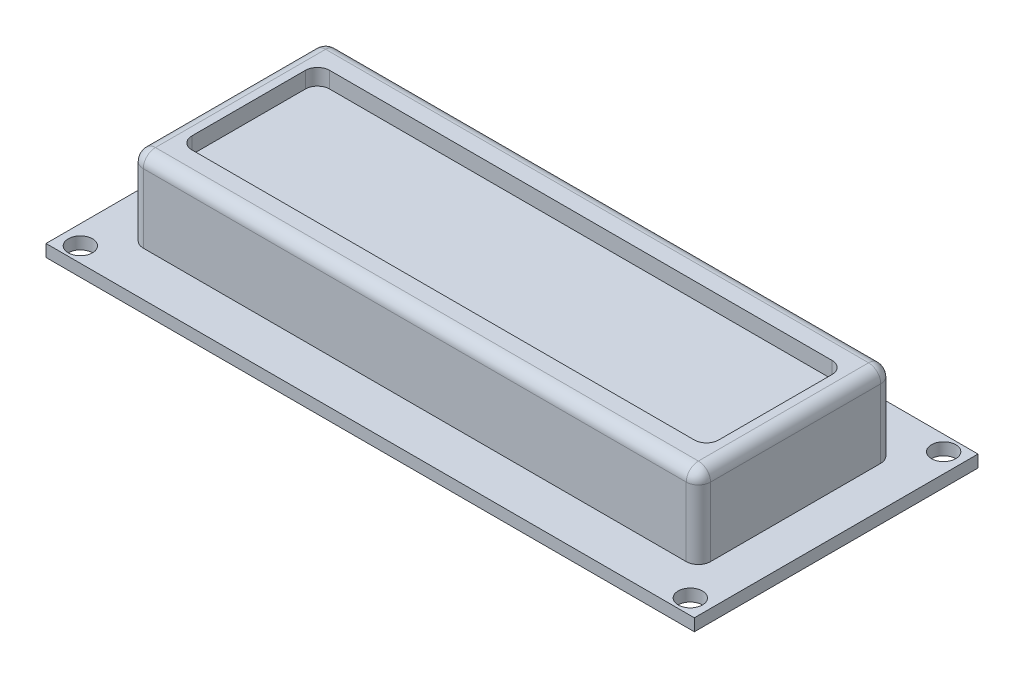
ISO-10303-21;
HEADER;
FILE_DESCRIPTION(('STEP AP214'),'2;1');
FILE_NAME('part.step','',(''),(''),'','','');
FILE_SCHEMA(('AUTOMOTIVE_DESIGN { 1 0 10303 214 1 1 1 1 }'));
ENDSEC;
DATA;
#1=APPLICATION_CONTEXT('core data for automotive mechanical design processes');
#2=APPLICATION_PROTOCOL_DEFINITION('international standard','automotive_design',2000,#1);
#3=PRODUCT_CONTEXT('',#1,'mechanical');
#4=PRODUCT('Part','Part','',(#3));
#5=PRODUCT_RELATED_PRODUCT_CATEGORY('part','',(#4));
#6=PRODUCT_DEFINITION_FORMATION('','',#4);
#7=PRODUCT_DEFINITION_CONTEXT('part definition',#1,'design');
#8=PRODUCT_DEFINITION('design','',#6,#7);
#9=PRODUCT_DEFINITION_SHAPE('','',#8);
#10=(LENGTH_UNIT() NAMED_UNIT(*) SI_UNIT(.MILLI.,.METRE.));
#11=(NAMED_UNIT(*) PLANE_ANGLE_UNIT() SI_UNIT($,.RADIAN.));
#12=(NAMED_UNIT(*) SI_UNIT($,.STERADIAN.) SOLID_ANGLE_UNIT());
#13=UNCERTAINTY_MEASURE_WITH_UNIT(LENGTH_MEASURE(1.E-05),#10,'distance_accuracy_value','');
#14=(GEOMETRIC_REPRESENTATION_CONTEXT(3) GLOBAL_UNCERTAINTY_ASSIGNED_CONTEXT((#13)) GLOBAL_UNIT_ASSIGNED_CONTEXT((#10,
#11,#12)) REPRESENTATION_CONTEXT('',''));
#15=CARTESIAN_POINT('',(0.,0.,0.));
#16=DIRECTION('',(0.,0.,1.));
#17=DIRECTION('',(1.,0.,0.));
#18=AXIS2_PLACEMENT_3D('',#15,#16,#17);
#19=CARTESIAN_POINT('',(0.,9.5,0.));
#20=DIRECTION('',(0.,-1.,0.));
#21=DIRECTION('',(0.,0.,-1.));
#22=AXIS2_PLACEMENT_3D('',#19,#20,#21);
#23=PLANE('',#22);
#24=CARTESIAN_POINT('',(31.,9.5,7.));
#25=DIRECTION('',(0.,-1.,0.));
#26=DIRECTION('',(0.,0.,-1.));
#27=AXIS2_PLACEMENT_3D('',#24,#25,#26);
#28=CIRCLE('',#27,1.5);
#29=CARTESIAN_POINT('',(31.,9.5,8.5));
#30=VERTEX_POINT('',#29);
#31=CARTESIAN_POINT('',(32.5,9.5,7.));
#32=VERTEX_POINT('',#31);
#33=EDGE_CURVE('E198',#30,#32,#28,.F.);
#34=ORIENTED_EDGE('',*,*,#33,.T.);
#35=DIRECTION('',(0.,0.,-1.));
#36=VECTOR('',#35,1.);
#37=CARTESIAN_POINT('',(32.5,9.5,8.5));
#38=LINE('',#37,#36);
#39=CARTESIAN_POINT('',(32.5,9.5,-7.));
#40=VERTEX_POINT('',#39);
#41=EDGE_CURVE('E194',#32,#40,#38,.T.);
#42=ORIENTED_EDGE('',*,*,#41,.T.);
#43=CARTESIAN_POINT('',(31.,9.5,-7.));
#44=DIRECTION('',(0.,-1.,0.));
#45=DIRECTION('',(0.,0.,-1.));
#46=AXIS2_PLACEMENT_3D('',#43,#44,#45);
#47=CIRCLE('',#46,1.5);
#48=CARTESIAN_POINT('',(31.,9.5,-8.5));
#49=VERTEX_POINT('',#48);
#50=EDGE_CURVE('E175',#40,#49,#47,.F.);
#51=ORIENTED_EDGE('',*,*,#50,.T.);
#52=DIRECTION('',(-1.,0.,0.));
#53=VECTOR('',#52,1.);
#54=CARTESIAN_POINT('',(-32.5,9.5,-8.5));
#55=LINE('',#54,#53);
#56=CARTESIAN_POINT('',(-31.,9.5,-8.5));
#57=VERTEX_POINT('',#56);
#58=EDGE_CURVE('E173',#49,#57,#55,.T.);
#59=ORIENTED_EDGE('',*,*,#58,.T.);
#60=CARTESIAN_POINT('',(-31.,9.5,-7.));
#61=DIRECTION('',(0.,-1.,0.));
#62=DIRECTION('',(0.,0.,-1.));
#63=AXIS2_PLACEMENT_3D('',#60,#61,#62);
#64=CIRCLE('',#63,1.5);
#65=CARTESIAN_POINT('',(-32.5,9.5,-7.));
#66=VERTEX_POINT('',#65);
#67=EDGE_CURVE('E19',#57,#66,#64,.F.);
#68=ORIENTED_EDGE('',*,*,#67,.T.);
#69=DIRECTION('',(0.,0.,1.));
#70=VECTOR('',#69,1.);
#71=CARTESIAN_POINT('',(-32.5,9.5,8.5));
#72=LINE('',#71,#70);
#73=CARTESIAN_POINT('',(-32.5,9.5,7.));
#74=VERTEX_POINT('',#73);
#75=EDGE_CURVE('E210',#66,#74,#72,.T.);
#76=ORIENTED_EDGE('',*,*,#75,.T.);
#77=CARTESIAN_POINT('',(-31.,9.5,7.));
#78=DIRECTION('',(0.,-1.,0.));
#79=DIRECTION('',(0.,0.,-1.));
#80=AXIS2_PLACEMENT_3D('',#77,#78,#79);
#81=CIRCLE('',#80,1.5);
#82=CARTESIAN_POINT('',(-31.,9.5,8.5));
#83=VERTEX_POINT('',#82);
#84=EDGE_CURVE('E206',#74,#83,#81,.F.);
#85=ORIENTED_EDGE('',*,*,#84,.T.);
#86=DIRECTION('',(1.,0.,0.));
#87=VECTOR('',#86,1.);
#88=CARTESIAN_POINT('',(-32.5,9.5,8.5));
#89=LINE('',#88,#87);
#90=EDGE_CURVE('E202',#83,#30,#89,.T.);
#91=ORIENTED_EDGE('',*,*,#90,.T.);
#92=EDGE_LOOP('',(#34,#42,#51,#59,#68,#76,#85,#91));
#93=FACE_BOUND('',#92,.T.);
#94=ADVANCED_FACE('F16',(#93),#23,.F.);
#95=CARTESIAN_POINT('',(-31.,9.5,-7.));
#96=DIRECTION('',(0.,-1.,0.));
#97=DIRECTION('',(0.,0.,-1.));
#98=AXIS2_PLACEMENT_3D('',#95,#96,#97);
#99=CYLINDRICAL_SURFACE('',#98,1.5);
#100=DIRECTION('',(0.,1.,0.));
#101=VECTOR('',#100,1.);
#102=CARTESIAN_POINT('',(-31.,9.5,-8.5));
#103=LINE('',#102,#101);
#104=CARTESIAN_POINT('',(-31.,11.5,-8.5));
#105=VERTEX_POINT('',#104);
#106=EDGE_CURVE('E166',#57,#105,#103,.T.);
#107=ORIENTED_EDGE('',*,*,#106,.T.);
#108=CARTESIAN_POINT('',(-31.,11.5,-7.));
#109=DIRECTION('',(0.,-1.,0.));
#110=DIRECTION('',(0.,0.,-1.));
#111=AXIS2_PLACEMENT_3D('',#108,#109,#110);
#112=CIRCLE('',#111,1.5);
#113=CARTESIAN_POINT('',(-32.5,11.5,-7.));
#114=VERTEX_POINT('',#113);
#115=EDGE_CURVE('E179',#105,#114,#112,.F.);
#116=ORIENTED_EDGE('',*,*,#115,.T.);
#117=DIRECTION('',(0.,1.,0.));
#118=VECTOR('',#117,1.);
#119=CARTESIAN_POINT('',(-32.5,9.5,-7.));
#120=LINE('',#119,#118);
#121=EDGE_CURVE('E169',#114,#66,#120,.F.);
#122=ORIENTED_EDGE('',*,*,#121,.T.);
#123=ORIENTED_EDGE('',*,*,#67,.F.);
#124=EDGE_LOOP('',(#107,#116,#122,#123));
#125=FACE_BOUND('',#124,.T.);
#126=ADVANCED_FACE('F164',(#125),#99,.F.);
#127=CARTESIAN_POINT('',(-32.5,9.5,8.5));
#128=DIRECTION('',(-1.,0.,0.));
#129=DIRECTION('',(0.,0.,1.));
#130=AXIS2_PLACEMENT_3D('',#127,#128,#129);
#131=PLANE('',#130);
#132=DIRECTION('',(0.,-1.,0.));
#133=VECTOR('',#132,1.);
#134=CARTESIAN_POINT('',(-32.5,9.5,7.));
#135=LINE('',#134,#133);
#136=CARTESIAN_POINT('',(-32.5,11.5,7.));
#137=VERTEX_POINT('',#136);
#138=EDGE_CURVE('E207',#137,#74,#135,.T.);
#139=ORIENTED_EDGE('',*,*,#138,.T.);
#140=ORIENTED_EDGE('',*,*,#75,.F.);
#141=ORIENTED_EDGE('',*,*,#121,.F.);
#142=DIRECTION('',(0.,0.,-1.));
#143=VECTOR('',#142,1.);
#144=CARTESIAN_POINT('',(-32.5,11.5,0.));
#145=LINE('',#144,#143);
#146=EDGE_CURVE('E262',#114,#137,#145,.F.);
#147=ORIENTED_EDGE('',*,*,#146,.T.);
#148=EDGE_LOOP('',(#139,#140,#141,#147));
#149=FACE_BOUND('',#148,.T.);
#150=ADVANCED_FACE('F384',(#149),#131,.F.);
#151=CARTESIAN_POINT('',(-31.,9.5,7.));
#152=DIRECTION('',(0.,-1.,0.));
#153=DIRECTION('',(0.,0.,-1.));
#154=AXIS2_PLACEMENT_3D('',#151,#152,#153);
#155=CYLINDRICAL_SURFACE('',#154,1.5);
#156=ORIENTED_EDGE('',*,*,#138,.F.);
#157=CARTESIAN_POINT('',(-31.,11.5,7.));
#158=DIRECTION('',(0.,-1.,0.));
#159=DIRECTION('',(0.,0.,-1.));
#160=AXIS2_PLACEMENT_3D('',#157,#158,#159);
#161=CIRCLE('',#160,1.5);
#162=CARTESIAN_POINT('',(-31.,11.5,8.5));
#163=VERTEX_POINT('',#162);
#164=EDGE_CURVE('E260',#137,#163,#161,.F.);
#165=ORIENTED_EDGE('',*,*,#164,.T.);
#166=DIRECTION('',(0.,1.,0.));
#167=VECTOR('',#166,1.);
#168=CARTESIAN_POINT('',(-31.,9.5,8.5));
#169=LINE('',#168,#167);
#170=EDGE_CURVE('E203',#163,#83,#169,.F.);
#171=ORIENTED_EDGE('',*,*,#170,.T.);
#172=ORIENTED_EDGE('',*,*,#84,.F.);
#173=EDGE_LOOP('',(#156,#165,#171,#172));
#174=FACE_BOUND('',#173,.T.);
#175=ADVANCED_FACE('F269',(#174),#155,.F.);
#176=CARTESIAN_POINT('',(-32.5,9.5,8.5));
#177=DIRECTION('',(0.,0.,1.));
#178=DIRECTION('',(1.,0.,0.));
#179=AXIS2_PLACEMENT_3D('',#176,#177,#178);
#180=PLANE('',#179);
#181=DIRECTION('',(0.,-1.,0.));
#182=VECTOR('',#181,1.);
#183=CARTESIAN_POINT('',(31.,9.5,8.5));
#184=LINE('',#183,#182);
#185=CARTESIAN_POINT('',(31.,11.5,8.5));
#186=VERTEX_POINT('',#185);
#187=EDGE_CURVE('E199',#186,#30,#184,.T.);
#188=ORIENTED_EDGE('',*,*,#187,.T.);
#189=ORIENTED_EDGE('',*,*,#90,.F.);
#190=ORIENTED_EDGE('',*,*,#170,.F.);
#191=DIRECTION('',(1.,0.,0.));
#192=VECTOR('',#191,1.);
#193=CARTESIAN_POINT('',(0.,11.5,8.5));
#194=LINE('',#193,#192);
#195=EDGE_CURVE('E259',#163,#186,#194,.T.);
#196=ORIENTED_EDGE('',*,*,#195,.T.);
#197=EDGE_LOOP('',(#188,#189,#190,#196));
#198=FACE_BOUND('',#197,.T.);
#199=ADVANCED_FACE('F273',(#198),#180,.F.);
#200=CARTESIAN_POINT('',(31.,9.5,7.));
#201=DIRECTION('',(0.,-1.,0.));
#202=DIRECTION('',(0.,0.,-1.));
#203=AXIS2_PLACEMENT_3D('',#200,#201,#202);
#204=CYLINDRICAL_SURFACE('',#203,1.5);
#205=ORIENTED_EDGE('',*,*,#187,.F.);
#206=CARTESIAN_POINT('',(31.,11.5,7.));
#207=DIRECTION('',(0.,-1.,0.));
#208=DIRECTION('',(0.,0.,-1.));
#209=AXIS2_PLACEMENT_3D('',#206,#207,#208);
#210=CIRCLE('',#209,1.5);
#211=CARTESIAN_POINT('',(32.5,11.5,7.));
#212=VERTEX_POINT('',#211);
#213=EDGE_CURVE('E257',#186,#212,#210,.F.);
#214=ORIENTED_EDGE('',*,*,#213,.T.);
#215=DIRECTION('',(0.,1.,0.));
#216=VECTOR('',#215,1.);
#217=CARTESIAN_POINT('',(32.5,9.5,7.));
#218=LINE('',#217,#216);
#219=EDGE_CURVE('E195',#212,#32,#218,.F.);
#220=ORIENTED_EDGE('',*,*,#219,.T.);
#221=ORIENTED_EDGE('',*,*,#33,.F.);
#222=EDGE_LOOP('',(#205,#214,#220,#221));
#223=FACE_BOUND('',#222,.T.);
#224=ADVANCED_FACE('F278',(#223),#204,.F.);
#225=CARTESIAN_POINT('',(32.5,9.5,8.5));
#226=DIRECTION('',(1.,0.,0.));
#227=DIRECTION('',(0.,0.,-1.));
#228=AXIS2_PLACEMENT_3D('',#225,#226,#227);
#229=PLANE('',#228);
#230=ORIENTED_EDGE('',*,*,#219,.F.);
#231=DIRECTION('',(0.,0.,-1.));
#232=VECTOR('',#231,1.);
#233=CARTESIAN_POINT('',(32.5,11.5,0.));
#234=LINE('',#233,#232);
#235=CARTESIAN_POINT('',(32.5,11.5,-7.));
#236=VERTEX_POINT('',#235);
#237=EDGE_CURVE('E256',#212,#236,#234,.T.);
#238=ORIENTED_EDGE('',*,*,#237,.T.);
#239=DIRECTION('',(0.,-1.,0.));
#240=VECTOR('',#239,1.);
#241=CARTESIAN_POINT('',(32.5,9.5,-7.));
#242=LINE('',#241,#240);
#243=EDGE_CURVE('E188',#236,#40,#242,.T.);
#244=ORIENTED_EDGE('',*,*,#243,.T.);
#245=ORIENTED_EDGE('',*,*,#41,.F.);
#246=EDGE_LOOP('',(#230,#238,#244,#245));
#247=FACE_BOUND('',#246,.T.);
#248=ADVANCED_FACE('F283',(#247),#229,.F.);
#249=CARTESIAN_POINT('',(31.,9.5,-7.));
#250=DIRECTION('',(0.,-1.,0.));
#251=DIRECTION('',(0.,0.,-1.));
#252=AXIS2_PLACEMENT_3D('',#249,#250,#251);
#253=CYLINDRICAL_SURFACE('',#252,1.5);
#254=ORIENTED_EDGE('',*,*,#243,.F.);
#255=CARTESIAN_POINT('',(31.,11.5,-7.));
#256=DIRECTION('',(0.,-1.,0.));
#257=DIRECTION('',(0.,0.,-1.));
#258=AXIS2_PLACEMENT_3D('',#255,#256,#257);
#259=CIRCLE('',#258,1.5);
#260=CARTESIAN_POINT('',(31.,11.5,-8.5));
#261=VERTEX_POINT('',#260);
#262=EDGE_CURVE('E254',#236,#261,#259,.F.);
#263=ORIENTED_EDGE('',*,*,#262,.T.);
#264=DIRECTION('',(0.,1.,0.));
#265=VECTOR('',#264,1.);
#266=CARTESIAN_POINT('',(31.,9.5,-8.5));
#267=LINE('',#266,#265);
#268=EDGE_CURVE('E180',#261,#49,#267,.F.);
#269=ORIENTED_EDGE('',*,*,#268,.T.);
#270=ORIENTED_EDGE('',*,*,#50,.F.);
#271=EDGE_LOOP('',(#254,#263,#269,#270));
#272=FACE_BOUND('',#271,.T.);
#273=ADVANCED_FACE('F287',(#272),#253,.F.);
#274=CARTESIAN_POINT('',(-32.5,9.5,-8.5));
#275=DIRECTION('',(0.,0.,-1.));
#276=DIRECTION('',(-1.,0.,0.));
#277=AXIS2_PLACEMENT_3D('',#274,#275,#276);
#278=PLANE('',#277);
#279=ORIENTED_EDGE('',*,*,#268,.F.);
#280=DIRECTION('',(1.,0.,0.));
#281=VECTOR('',#280,1.);
#282=CARTESIAN_POINT('',(0.,11.5,-8.5));
#283=LINE('',#282,#281);
#284=EDGE_CURVE('E184',#261,#105,#283,.F.);
#285=ORIENTED_EDGE('',*,*,#284,.T.);
#286=ORIENTED_EDGE('',*,*,#106,.F.);
#287=ORIENTED_EDGE('',*,*,#58,.F.);
#288=EDGE_LOOP('',(#279,#285,#286,#287));
#289=FACE_BOUND('',#288,.T.);
#290=ADVANCED_FACE('F182',(#289),#278,.F.);
#291=CARTESIAN_POINT('',(0.,11.5,0.));
#292=DIRECTION('',(0.,-1.,0.));
#293=DIRECTION('',(0.,0.,-1.));
#294=AXIS2_PLACEMENT_3D('',#291,#292,#293);
#295=PLANE('',#294);
#296=ORIENTED_EDGE('',*,*,#262,.F.);
#297=ORIENTED_EDGE('',*,*,#237,.F.);
#298=ORIENTED_EDGE('',*,*,#213,.F.);
#299=ORIENTED_EDGE('',*,*,#195,.F.);
#300=ORIENTED_EDGE('',*,*,#164,.F.);
#301=ORIENTED_EDGE('',*,*,#146,.F.);
#302=ORIENTED_EDGE('',*,*,#115,.F.);
#303=ORIENTED_EDGE('',*,*,#284,.F.);
#304=EDGE_LOOP('',(#296,#297,#298,#299,#300,#301,#302,#303));
#305=FACE_BOUND('',#304,.T.);
#306=DIRECTION('',(0.,0.,-1.));
#307=VECTOR('',#306,1.);
#308=CARTESIAN_POINT('',(33.5,11.5,0.));
#309=LINE('',#308,#307);
#310=CARTESIAN_POINT('',(33.5,11.5,-10.5));
#311=VERTEX_POINT('',#310);
#312=CARTESIAN_POINT('',(33.5,11.5,10.5));
#313=VERTEX_POINT('',#312);
#314=EDGE_CURVE('E304',#311,#313,#309,.F.);
#315=ORIENTED_EDGE('',*,*,#314,.F.);
#316=DIRECTION('',(-1.,0.,0.));
#317=VECTOR('',#316,1.);
#318=CARTESIAN_POINT('',(0.,11.5,-10.5));
#319=LINE('',#318,#317);
#320=CARTESIAN_POINT('',(-33.5,11.5,-10.4999999999908));
#321=VERTEX_POINT('',#320);
#322=EDGE_CURVE('E292',#321,#311,#319,.F.);
#323=ORIENTED_EDGE('',*,*,#322,.F.);
#324=DIRECTION('',(0.,0.,1.));
#325=VECTOR('',#324,1.);
#326=CARTESIAN_POINT('',(-33.5,11.5,0.));
#327=LINE('',#326,#325);
#328=CARTESIAN_POINT('',(-33.5,11.5,10.5));
#329=VERTEX_POINT('',#328);
#330=EDGE_CURVE('E318',#329,#321,#327,.F.);
#331=ORIENTED_EDGE('',*,*,#330,.F.);
#332=DIRECTION('',(1.,0.,0.));
#333=VECTOR('',#332,1.);
#334=CARTESIAN_POINT('',(0.,11.5,10.5));
#335=LINE('',#334,#333);
#336=EDGE_CURVE('E311',#313,#329,#335,.F.);
#337=ORIENTED_EDGE('',*,*,#336,.F.);
#338=EDGE_LOOP('',(#315,#323,#331,#337));
#339=FACE_BOUND('',#338,.T.);
#340=ADVANCED_FACE('F289',(#305,#339),#295,.F.);
#341=CARTESIAN_POINT('',(33.5,10.,-10.5));
#342=DIRECTION('',(1.,0.,0.));
#343=DIRECTION('',(0.,0.,-1.));
#344=AXIS2_PLACEMENT_3D('',#341,#342,#343);
#345=SPHERICAL_SURFACE('',#344,1.5);
#346=CARTESIAN_POINT('',(33.5,10.,-10.5));
#347=DIRECTION('',(-1.,0.,0.));
#348=DIRECTION('',(0.,0.,1.));
#349=AXIS2_PLACEMENT_3D('',#346,#347,#348);
#350=CIRCLE('',#349,1.5);
#351=CARTESIAN_POINT('',(33.5,10.,-12.));
#352=VERTEX_POINT('',#351);
#353=EDGE_CURVE('E295',#311,#352,#350,.T.);
#354=ORIENTED_EDGE('',*,*,#353,.F.);
#355=CARTESIAN_POINT('',(33.5,10.,-10.5));
#356=DIRECTION('',(0.,0.,-1.));
#357=DIRECTION('',(-1.,0.,0.));
#358=AXIS2_PLACEMENT_3D('',#355,#356,#357);
#359=CIRCLE('',#358,1.5);
#360=CARTESIAN_POINT('',(35.,10.,-10.5));
#361=VERTEX_POINT('',#360);
#362=EDGE_CURVE('E308',#361,#311,#359,.F.);
#363=ORIENTED_EDGE('',*,*,#362,.F.);
#364=CARTESIAN_POINT('',(33.5,10.,-10.5));
#365=DIRECTION('',(0.,-1.,0.));
#366=DIRECTION('',(0.,0.,-1.));
#367=AXIS2_PLACEMENT_3D('',#364,#365,#366);
#368=CIRCLE('',#367,1.5);
#369=EDGE_CURVE('E307',#352,#361,#368,.T.);
#370=ORIENTED_EDGE('',*,*,#369,.F.);
#371=EDGE_LOOP('',(#354,#363,#370));
#372=FACE_BOUND('',#371,.T.);
#373=ADVANCED_FACE('F365',(#372),#345,.T.);
#374=CARTESIAN_POINT('',(0.,10.,-10.5));
#375=DIRECTION('',(-1.,0.,0.));
#376=DIRECTION('',(0.,0.,1.));
#377=AXIS2_PLACEMENT_3D('',#374,#375,#376);
#378=CYLINDRICAL_SURFACE('',#377,1.5);
#379=ORIENTED_EDGE('',*,*,#353,.T.);
#380=DIRECTION('',(1.,0.,0.));
#381=VECTOR('',#380,1.);
#382=CARTESIAN_POINT('',(-35.,10.,-12.));
#383=LINE('',#382,#381);
#384=CARTESIAN_POINT('',(-33.5,10.,-12.));
#385=VERTEX_POINT('',#384);
#386=EDGE_CURVE('E345',#352,#385,#383,.F.);
#387=ORIENTED_EDGE('',*,*,#386,.T.);
#388=CARTESIAN_POINT('',(-33.5,10.,-10.5));
#389=DIRECTION('',(1.,0.,0.));
#390=DIRECTION('',(0.,0.,-1.));
#391=AXIS2_PLACEMENT_3D('',#388,#389,#390);
#392=CIRCLE('',#391,1.5);
#393=EDGE_CURVE('E330',#321,#385,#392,.F.);
#394=ORIENTED_EDGE('',*,*,#393,.F.);
#395=ORIENTED_EDGE('',*,*,#322,.T.);
#396=EDGE_LOOP('',(#379,#387,#394,#395));
#397=FACE_BOUND('',#396,.T.);
#398=ADVANCED_FACE('F360',(#397),#378,.T.);
#399=CARTESIAN_POINT('',(-33.5,10.,-10.5));
#400=DIRECTION('',(1.,0.,0.));
#401=DIRECTION('',(0.,0.,-1.));
#402=AXIS2_PLACEMENT_3D('',#399,#400,#401);
#403=SPHERICAL_SURFACE('',#402,1.5);
#404=CARTESIAN_POINT('',(-33.5,10.,-10.5));
#405=DIRECTION('',(0.,0.,1.));
#406=DIRECTION('',(1.,0.,0.));
#407=AXIS2_PLACEMENT_3D('',#404,#405,#406);
#408=CIRCLE('',#407,1.5);
#409=CARTESIAN_POINT('',(-35.,10.,-10.5));
#410=VERTEX_POINT('',#409);
#411=EDGE_CURVE('E322',#321,#410,#408,.T.);
#412=ORIENTED_EDGE('',*,*,#411,.F.);
#413=ORIENTED_EDGE('',*,*,#393,.T.);
#414=CARTESIAN_POINT('',(-33.5,10.,-10.5));
#415=DIRECTION('',(0.,-1.,0.));
#416=DIRECTION('',(0.,0.,-1.));
#417=AXIS2_PLACEMENT_3D('',#414,#415,#416);
#418=CIRCLE('',#417,1.5);
#419=EDGE_CURVE('E341',#410,#385,#418,.T.);
#420=ORIENTED_EDGE('',*,*,#419,.F.);
#421=EDGE_LOOP('',(#412,#413,#420));
#422=FACE_BOUND('',#421,.T.);
#423=ADVANCED_FACE('F355',(#422),#403,.T.);
#424=CARTESIAN_POINT('',(-33.5,10.,0.));
#425=DIRECTION('',(0.,0.,1.));
#426=DIRECTION('',(1.,0.,0.));
#427=AXIS2_PLACEMENT_3D('',#424,#425,#426);
#428=CYLINDRICAL_SURFACE('',#427,1.5);
#429=CARTESIAN_POINT('',(-33.5,10.,10.5));
#430=DIRECTION('',(0.,0.,1.));
#431=DIRECTION('',(1.,0.,0.));
#432=AXIS2_PLACEMENT_3D('',#429,#430,#431);
#433=CIRCLE('',#432,1.5);
#434=CARTESIAN_POINT('',(-35.,10.,10.5));
#435=VERTEX_POINT('',#434);
#436=EDGE_CURVE('E321',#329,#435,#433,.T.);
#437=ORIENTED_EDGE('',*,*,#436,.F.);
#438=ORIENTED_EDGE('',*,*,#330,.T.);
#439=ORIENTED_EDGE('',*,*,#411,.T.);
#440=DIRECTION('',(0.,0.,-1.));
#441=VECTOR('',#440,1.);
#442=CARTESIAN_POINT('',(-35.,10.,12.));
#443=LINE('',#442,#441);
#444=EDGE_CURVE('E497',#410,#435,#443,.F.);
#445=ORIENTED_EDGE('',*,*,#444,.T.);
#446=EDGE_LOOP('',(#437,#438,#439,#445));
#447=FACE_BOUND('',#446,.T.);
#448=ADVANCED_FACE('F359',(#447),#428,.T.);
#449=CARTESIAN_POINT('',(-33.5,10.,10.5));
#450=DIRECTION('',(1.,0.,0.));
#451=DIRECTION('',(0.,0.,-1.));
#452=AXIS2_PLACEMENT_3D('',#449,#450,#451);
#453=SPHERICAL_SURFACE('',#452,1.5);
#454=CARTESIAN_POINT('',(-33.5,10.,10.5));
#455=DIRECTION('',(0.,-1.,0.));
#456=DIRECTION('',(0.,0.,-1.));
#457=AXIS2_PLACEMENT_3D('',#454,#455,#456);
#458=CIRCLE('',#457,1.5);
#459=CARTESIAN_POINT('',(-33.5,10.,12.));
#460=VERTEX_POINT('',#459);
#461=EDGE_CURVE('E493',#460,#435,#458,.T.);
#462=ORIENTED_EDGE('',*,*,#461,.F.);
#463=CARTESIAN_POINT('',(-33.5,10.,10.5));
#464=DIRECTION('',(1.,0.,0.));
#465=DIRECTION('',(0.,0.,-1.));
#466=AXIS2_PLACEMENT_3D('',#463,#464,#465);
#467=CIRCLE('',#466,1.5);
#468=EDGE_CURVE('E315',#329,#460,#467,.T.);
#469=ORIENTED_EDGE('',*,*,#468,.F.);
#470=ORIENTED_EDGE('',*,*,#436,.T.);
#471=EDGE_LOOP('',(#462,#469,#470));
#472=FACE_BOUND('',#471,.T.);
#473=ADVANCED_FACE('F505',(#472),#453,.T.);
#474=CARTESIAN_POINT('',(0.,10.,10.5));
#475=DIRECTION('',(1.,0.,0.));
#476=DIRECTION('',(0.,0.,-1.));
#477=AXIS2_PLACEMENT_3D('',#474,#475,#476);
#478=CYLINDRICAL_SURFACE('',#477,1.5);
#479=CARTESIAN_POINT('',(33.5,10.,10.5));
#480=DIRECTION('',(1.,0.,0.));
#481=DIRECTION('',(0.,0.,-1.));
#482=AXIS2_PLACEMENT_3D('',#479,#480,#481);
#483=CIRCLE('',#482,1.5);
#484=CARTESIAN_POINT('',(33.5,10.,12.));
#485=VERTEX_POINT('',#484);
#486=EDGE_CURVE('E314',#313,#485,#483,.T.);
#487=ORIENTED_EDGE('',*,*,#486,.F.);
#488=ORIENTED_EDGE('',*,*,#336,.T.);
#489=ORIENTED_EDGE('',*,*,#468,.T.);
#490=DIRECTION('',(-1.,0.,0.));
#491=VECTOR('',#490,1.);
#492=CARTESIAN_POINT('',(-35.,10.,12.));
#493=LINE('',#492,#491);
#494=EDGE_CURVE('E522',#460,#485,#493,.F.);
#495=ORIENTED_EDGE('',*,*,#494,.T.);
#496=EDGE_LOOP('',(#487,#488,#489,#495));
#497=FACE_BOUND('',#496,.T.);
#498=ADVANCED_FACE('F477',(#497),#478,.T.);
#499=CARTESIAN_POINT('',(33.5,10.,10.5));
#500=DIRECTION('',(1.,0.,0.));
#501=DIRECTION('',(0.,0.,-1.));
#502=AXIS2_PLACEMENT_3D('',#499,#500,#501);
#503=SPHERICAL_SURFACE('',#502,1.5);
#504=CARTESIAN_POINT('',(33.5,10.,10.5));
#505=DIRECTION('',(0.,-1.,0.));
#506=DIRECTION('',(0.,0.,-1.));
#507=AXIS2_PLACEMENT_3D('',#504,#505,#506);
#508=CIRCLE('',#507,1.5);
#509=CARTESIAN_POINT('',(35.,10.,10.5));
#510=VERTEX_POINT('',#509);
#511=EDGE_CURVE('E529',#510,#485,#508,.T.);
#512=ORIENTED_EDGE('',*,*,#511,.F.);
#513=CARTESIAN_POINT('',(33.5,10.,10.5));
#514=DIRECTION('',(0.,0.,-1.));
#515=DIRECTION('',(-1.,0.,0.));
#516=AXIS2_PLACEMENT_3D('',#513,#514,#515);
#517=CIRCLE('',#516,1.5);
#518=EDGE_CURVE('E486',#313,#510,#517,.T.);
#519=ORIENTED_EDGE('',*,*,#518,.F.);
#520=ORIENTED_EDGE('',*,*,#486,.T.);
#521=EDGE_LOOP('',(#512,#519,#520));
#522=FACE_BOUND('',#521,.T.);
#523=ADVANCED_FACE('F472',(#522),#503,.T.);
#524=CARTESIAN_POINT('',(33.5,10.,0.));
#525=DIRECTION('',(0.,0.,-1.));
#526=DIRECTION('',(-1.,0.,0.));
#527=AXIS2_PLACEMENT_3D('',#524,#525,#526);
#528=CYLINDRICAL_SURFACE('',#527,1.5);
#529=ORIENTED_EDGE('',*,*,#362,.T.);
#530=ORIENTED_EDGE('',*,*,#314,.T.);
#531=ORIENTED_EDGE('',*,*,#518,.T.);
#532=DIRECTION('',(0.,0.,1.));
#533=VECTOR('',#532,1.);
#534=CARTESIAN_POINT('',(35.,10.,12.));
#535=LINE('',#534,#533);
#536=EDGE_CURVE('E253',#510,#361,#535,.F.);
#537=ORIENTED_EDGE('',*,*,#536,.T.);
#538=EDGE_LOOP('',(#529,#530,#531,#537));
#539=FACE_BOUND('',#538,.T.);
#540=ADVANCED_FACE('F468',(#539),#528,.T.);
#541=CARTESIAN_POINT('',(33.5,11.5,-10.5));
#542=DIRECTION('',(0.,-1.,0.));
#543=DIRECTION('',(0.,0.,-1.));
#544=AXIS2_PLACEMENT_3D('',#541,#542,#543);
#545=CYLINDRICAL_SURFACE('',#544,1.5);
#546=ORIENTED_EDGE('',*,*,#369,.T.);
#547=DIRECTION('',(0.,1.,0.));
#548=VECTOR('',#547,1.);
#549=CARTESIAN_POINT('',(35.,11.5,-10.5));
#550=LINE('',#549,#548);
#551=CARTESIAN_POINT('',(35.,1.5,-10.5));
#552=VERTEX_POINT('',#551);
#553=EDGE_CURVE('E571',#361,#552,#550,.F.);
#554=ORIENTED_EDGE('',*,*,#553,.T.);
#555=CARTESIAN_POINT('',(33.5,1.5,-10.5));
#556=DIRECTION('',(0.,-1.,0.));
#557=DIRECTION('',(0.,0.,-1.));
#558=AXIS2_PLACEMENT_3D('',#555,#556,#557);
#559=CIRCLE('',#558,1.5);
#560=CARTESIAN_POINT('',(33.5,1.5,-12.));
#561=VERTEX_POINT('',#560);
#562=EDGE_CURVE('E251',#552,#561,#559,.F.);
#563=ORIENTED_EDGE('',*,*,#562,.T.);
#564=DIRECTION('',(0.,1.,0.));
#565=VECTOR('',#564,1.);
#566=CARTESIAN_POINT('',(33.5,11.5,-12.));
#567=LINE('',#566,#565);
#568=EDGE_CURVE('E349',#561,#352,#567,.T.);
#569=ORIENTED_EDGE('',*,*,#568,.T.);
#570=EDGE_LOOP('',(#546,#554,#563,#569));
#571=FACE_BOUND('',#570,.T.);
#572=ADVANCED_FACE('F464',(#571),#545,.T.);
#573=CARTESIAN_POINT('',(-35.,11.5,-12.));
#574=DIRECTION('',(0.,0.,1.));
#575=DIRECTION('',(1.,0.,0.));
#576=AXIS2_PLACEMENT_3D('',#573,#574,#575);
#577=PLANE('',#576);
#578=DIRECTION('',(0.,-1.,0.));
#579=VECTOR('',#578,1.);
#580=CARTESIAN_POINT('',(-33.5,11.5,-12.));
#581=LINE('',#580,#579);
#582=CARTESIAN_POINT('',(-33.5,1.5,-12.));
#583=VERTEX_POINT('',#582);
#584=EDGE_CURVE('E344',#385,#583,#581,.T.);
#585=ORIENTED_EDGE('',*,*,#584,.F.);
#586=ORIENTED_EDGE('',*,*,#386,.F.);
#587=ORIENTED_EDGE('',*,*,#568,.F.);
#588=DIRECTION('',(1.,0.,0.));
#589=VECTOR('',#588,1.);
#590=CARTESIAN_POINT('',(0.,1.5,-12.));
#591=LINE('',#590,#589);
#592=EDGE_CURVE('E250',#561,#583,#591,.F.);
#593=ORIENTED_EDGE('',*,*,#592,.T.);
#594=EDGE_LOOP('',(#585,#586,#587,#593));
#595=FACE_BOUND('',#594,.T.);
#596=ADVANCED_FACE('F460',(#595),#577,.F.);
#597=CARTESIAN_POINT('',(-33.5,11.5,-10.5));
#598=DIRECTION('',(0.,-1.,0.));
#599=DIRECTION('',(0.,0.,-1.));
#600=AXIS2_PLACEMENT_3D('',#597,#598,#599);
#601=CYLINDRICAL_SURFACE('',#600,1.5);
#602=ORIENTED_EDGE('',*,*,#419,.T.);
#603=ORIENTED_EDGE('',*,*,#584,.T.);
#604=CARTESIAN_POINT('',(-33.5,1.5,-10.5));
#605=DIRECTION('',(0.,-1.,0.));
#606=DIRECTION('',(0.,0.,-1.));
#607=AXIS2_PLACEMENT_3D('',#604,#605,#606);
#608=CIRCLE('',#607,1.5);
#609=CARTESIAN_POINT('',(-35.,1.5,-10.5));
#610=VERTEX_POINT('',#609);
#611=EDGE_CURVE('E248',#583,#610,#608,.F.);
#612=ORIENTED_EDGE('',*,*,#611,.T.);
#613=DIRECTION('',(0.,1.,0.));
#614=VECTOR('',#613,1.);
#615=CARTESIAN_POINT('',(-35.,11.5,-10.5));
#616=LINE('',#615,#614);
#617=EDGE_CURVE('E501',#610,#410,#616,.T.);
#618=ORIENTED_EDGE('',*,*,#617,.T.);
#619=EDGE_LOOP('',(#602,#603,#612,#618));
#620=FACE_BOUND('',#619,.T.);
#621=ADVANCED_FACE('F456',(#620),#601,.T.);
#622=CARTESIAN_POINT('',(-35.,11.5,12.));
#623=DIRECTION('',(1.,0.,0.));
#624=DIRECTION('',(0.,0.,-1.));
#625=AXIS2_PLACEMENT_3D('',#622,#623,#624);
#626=PLANE('',#625);
#627=DIRECTION('',(0.,-1.,0.));
#628=VECTOR('',#627,1.);
#629=CARTESIAN_POINT('',(-35.,11.5,10.5));
#630=LINE('',#629,#628);
#631=CARTESIAN_POINT('',(-35.,1.5,10.5));
#632=VERTEX_POINT('',#631);
#633=EDGE_CURVE('E496',#435,#632,#630,.T.);
#634=ORIENTED_EDGE('',*,*,#633,.F.);
#635=ORIENTED_EDGE('',*,*,#444,.F.);
#636=ORIENTED_EDGE('',*,*,#617,.F.);
#637=DIRECTION('',(0.,0.,-1.));
#638=VECTOR('',#637,1.);
#639=CARTESIAN_POINT('',(-35.,1.5,0.));
#640=LINE('',#639,#638);
#641=EDGE_CURVE('E247',#610,#632,#640,.F.);
#642=ORIENTED_EDGE('',*,*,#641,.T.);
#643=EDGE_LOOP('',(#634,#635,#636,#642));
#644=FACE_BOUND('',#643,.T.);
#645=ADVANCED_FACE('F452',(#644),#626,.F.);
#646=CARTESIAN_POINT('',(-33.5,11.5,10.5));
#647=DIRECTION('',(0.,-1.,0.));
#648=DIRECTION('',(0.,0.,-1.));
#649=AXIS2_PLACEMENT_3D('',#646,#647,#648);
#650=CYLINDRICAL_SURFACE('',#649,1.5);
#651=ORIENTED_EDGE('',*,*,#461,.T.);
#652=ORIENTED_EDGE('',*,*,#633,.T.);
#653=CARTESIAN_POINT('',(-33.5,1.5,10.5));
#654=DIRECTION('',(0.,-1.,0.));
#655=DIRECTION('',(0.,0.,-1.));
#656=AXIS2_PLACEMENT_3D('',#653,#654,#655);
#657=CIRCLE('',#656,1.5);
#658=CARTESIAN_POINT('',(-33.5,1.5,12.));
#659=VERTEX_POINT('',#658);
#660=EDGE_CURVE('E245',#632,#659,#657,.F.);
#661=ORIENTED_EDGE('',*,*,#660,.T.);
#662=DIRECTION('',(0.,1.,0.));
#663=VECTOR('',#662,1.);
#664=CARTESIAN_POINT('',(-33.5,11.5,12.));
#665=LINE('',#664,#663);
#666=EDGE_CURVE('E518',#659,#460,#665,.T.);
#667=ORIENTED_EDGE('',*,*,#666,.T.);
#668=EDGE_LOOP('',(#651,#652,#661,#667));
#669=FACE_BOUND('',#668,.T.);
#670=ADVANCED_FACE('F448',(#669),#650,.T.);
#671=CARTESIAN_POINT('',(-35.,11.5,12.));
#672=DIRECTION('',(0.,0.,-1.));
#673=DIRECTION('',(-1.,0.,0.));
#674=AXIS2_PLACEMENT_3D('',#671,#672,#673);
#675=PLANE('',#674);
#676=ORIENTED_EDGE('',*,*,#666,.F.);
#677=DIRECTION('',(1.,0.,0.));
#678=VECTOR('',#677,1.);
#679=CARTESIAN_POINT('',(0.,1.5,12.));
#680=LINE('',#679,#678);
#681=CARTESIAN_POINT('',(33.5,1.5,12.));
#682=VERTEX_POINT('',#681);
#683=EDGE_CURVE('E244',#659,#682,#680,.T.);
#684=ORIENTED_EDGE('',*,*,#683,.T.);
#685=DIRECTION('',(0.,-1.,0.));
#686=VECTOR('',#685,1.);
#687=CARTESIAN_POINT('',(33.5,11.5,12.));
#688=LINE('',#687,#686);
#689=EDGE_CURVE('E527',#485,#682,#688,.T.);
#690=ORIENTED_EDGE('',*,*,#689,.F.);
#691=ORIENTED_EDGE('',*,*,#494,.F.);
#692=EDGE_LOOP('',(#676,#684,#690,#691));
#693=FACE_BOUND('',#692,.T.);
#694=ADVANCED_FACE('F444',(#693),#675,.F.);
#695=CARTESIAN_POINT('',(33.5,11.5,10.5));
#696=DIRECTION('',(0.,-1.,0.));
#697=DIRECTION('',(0.,0.,-1.));
#698=AXIS2_PLACEMENT_3D('',#695,#696,#697);
#699=CYLINDRICAL_SURFACE('',#698,1.5);
#700=ORIENTED_EDGE('',*,*,#511,.T.);
#701=ORIENTED_EDGE('',*,*,#689,.T.);
#702=CARTESIAN_POINT('',(33.5,1.5,10.5));
#703=DIRECTION('',(0.,-1.,0.));
#704=DIRECTION('',(0.,0.,-1.));
#705=AXIS2_PLACEMENT_3D('',#702,#703,#704);
#706=CIRCLE('',#705,1.5);
#707=CARTESIAN_POINT('',(35.,1.5,10.5));
#708=VERTEX_POINT('',#707);
#709=EDGE_CURVE('E242',#682,#708,#706,.F.);
#710=ORIENTED_EDGE('',*,*,#709,.T.);
#711=DIRECTION('',(0.,1.,0.));
#712=VECTOR('',#711,1.);
#713=CARTESIAN_POINT('',(35.,11.5,10.5));
#714=LINE('',#713,#712);
#715=EDGE_CURVE('E544',#708,#510,#714,.T.);
#716=ORIENTED_EDGE('',*,*,#715,.T.);
#717=EDGE_LOOP('',(#700,#701,#710,#716));
#718=FACE_BOUND('',#717,.T.);
#719=ADVANCED_FACE('F440',(#718),#699,.T.);
#720=CARTESIAN_POINT('',(35.,11.5,12.));
#721=DIRECTION('',(-1.,0.,0.));
#722=DIRECTION('',(0.,0.,1.));
#723=AXIS2_PLACEMENT_3D('',#720,#721,#722);
#724=PLANE('',#723);
#725=ORIENTED_EDGE('',*,*,#715,.F.);
#726=DIRECTION('',(0.,0.,-1.));
#727=VECTOR('',#726,1.);
#728=CARTESIAN_POINT('',(35.,1.5,0.));
#729=LINE('',#728,#727);
#730=EDGE_CURVE('E241',#708,#552,#729,.T.);
#731=ORIENTED_EDGE('',*,*,#730,.T.);
#732=ORIENTED_EDGE('',*,*,#553,.F.);
#733=ORIENTED_EDGE('',*,*,#536,.F.);
#734=EDGE_LOOP('',(#725,#731,#732,#733));
#735=FACE_BOUND('',#734,.T.);
#736=ADVANCED_FACE('F436',(#735),#724,.F.);
#737=CARTESIAN_POINT('',(0.,1.5,0.));
#738=DIRECTION('',(0.,-1.,0.));
#739=DIRECTION('',(0.,0.,-1.));
#740=AXIS2_PLACEMENT_3D('',#737,#738,#739);
#741=PLANE('',#740);
#742=ORIENTED_EDGE('',*,*,#709,.F.);
#743=ORIENTED_EDGE('',*,*,#683,.F.);
#744=ORIENTED_EDGE('',*,*,#660,.F.);
#745=ORIENTED_EDGE('',*,*,#641,.F.);
#746=ORIENTED_EDGE('',*,*,#611,.F.);
#747=ORIENTED_EDGE('',*,*,#592,.F.);
#748=ORIENTED_EDGE('',*,*,#562,.F.);
#749=ORIENTED_EDGE('',*,*,#730,.F.);
#750=EDGE_LOOP('',(#742,#743,#744,#745,#746,#747,#748,#749));
#751=FACE_BOUND('',#750,.T.);
#752=CARTESIAN_POINT('',(37.63,1.5,-15.63));
#753=DIRECTION('',(0.,1.,0.));
#754=DIRECTION('',(0.,0.,1.));
#755=AXIS2_PLACEMENT_3D('',#752,#753,#754);
#756=CIRCLE('',#755,1.50000000000001);
#757=CARTESIAN_POINT('',(37.63,1.5,-14.13));
#758=VERTEX_POINT('',#757);
#759=EDGE_CURVE('E238',#758,#758,#756,.F.);
#760=ORIENTED_EDGE('',*,*,#759,.T.);
#761=EDGE_LOOP('',(#760));
#762=FACE_BOUND('',#761,.T.);
#763=CARTESIAN_POINT('',(37.63,1.5,15.63));
#764=DIRECTION('',(0.,1.,0.));
#765=DIRECTION('',(0.,0.,1.));
#766=AXIS2_PLACEMENT_3D('',#763,#764,#765);
#767=CIRCLE('',#766,1.50000000000001);
#768=CARTESIAN_POINT('',(37.63,1.5,17.13));
#769=VERTEX_POINT('',#768);
#770=EDGE_CURVE('E235',#769,#769,#767,.F.);
#771=ORIENTED_EDGE('',*,*,#770,.T.);
#772=EDGE_LOOP('',(#771));
#773=FACE_BOUND('',#772,.T.);
#774=CARTESIAN_POINT('',(-37.63,1.5,15.63));
#775=DIRECTION('',(0.,1.,0.));
#776=DIRECTION('',(0.,0.,1.));
#777=AXIS2_PLACEMENT_3D('',#774,#775,#776);
#778=CIRCLE('',#777,1.50000000000001);
#779=CARTESIAN_POINT('',(-37.63,1.5,17.13));
#780=VERTEX_POINT('',#779);
#781=EDGE_CURVE('E232',#780,#780,#778,.F.);
#782=ORIENTED_EDGE('',*,*,#781,.T.);
#783=EDGE_LOOP('',(#782));
#784=FACE_BOUND('',#783,.T.);
#785=CARTESIAN_POINT('',(-37.63,1.5,-15.63));
#786=DIRECTION('',(0.,1.,0.));
#787=DIRECTION('',(0.,0.,1.));
#788=AXIS2_PLACEMENT_3D('',#785,#786,#787);
#789=CIRCLE('',#788,1.50000000000001);
#790=CARTESIAN_POINT('',(-37.63,1.5,-14.13));
#791=VERTEX_POINT('',#790);
#792=EDGE_CURVE('E228',#791,#791,#789,.F.);
#793=ORIENTED_EDGE('',*,*,#792,.T.);
#794=EDGE_LOOP('',(#793));
#795=FACE_BOUND('',#794,.T.);
#796=DIRECTION('',(1.,0.,0.));
#797=VECTOR('',#796,1.);
#798=CARTESIAN_POINT('',(-40.,1.5,-17.5));
#799=LINE('',#798,#797);
#800=CARTESIAN_POINT('',(40.,1.5,-17.5));
#801=VERTEX_POINT('',#800);
#802=CARTESIAN_POINT('',(-40.,1.5,-17.5));
#803=VERTEX_POINT('',#802);
#804=EDGE_CURVE('E596',#801,#803,#799,.F.);
#805=ORIENTED_EDGE('',*,*,#804,.T.);
#806=DIRECTION('',(0.,0.,-1.));
#807=VECTOR('',#806,1.);
#808=CARTESIAN_POINT('',(-40.,1.5,17.5));
#809=LINE('',#808,#807);
#810=CARTESIAN_POINT('',(-40.,1.5,17.5));
#811=VERTEX_POINT('',#810);
#812=EDGE_CURVE('E589',#803,#811,#809,.F.);
#813=ORIENTED_EDGE('',*,*,#812,.T.);
#814=DIRECTION('',(-1.,0.,0.));
#815=VECTOR('',#814,1.);
#816=CARTESIAN_POINT('',(-40.,1.5,17.5));
#817=LINE('',#816,#815);
#818=CARTESIAN_POINT('',(40.,1.5,17.5));
#819=VERTEX_POINT('',#818);
#820=EDGE_CURVE('E585',#811,#819,#817,.F.);
#821=ORIENTED_EDGE('',*,*,#820,.T.);
#822=DIRECTION('',(0.,0.,1.));
#823=VECTOR('',#822,1.);
#824=CARTESIAN_POINT('',(40.,1.5,17.5));
#825=LINE('',#824,#823);
#826=EDGE_CURVE('E231',#819,#801,#825,.F.);
#827=ORIENTED_EDGE('',*,*,#826,.T.);
#828=EDGE_LOOP('',(#805,#813,#821,#827));
#829=FACE_BOUND('',#828,.T.);
#830=ADVANCED_FACE('F432',(#751,#762,#773,#784,#795,#829),#741,.F.);
#831=CARTESIAN_POINT('',(37.63,0.,-15.63));
#832=DIRECTION('',(0.,1.,0.));
#833=DIRECTION('',(0.,0.,1.));
#834=AXIS2_PLACEMENT_3D('',#831,#832,#833);
#835=CYLINDRICAL_SURFACE('',#834,1.50000000000001);
#836=ORIENTED_EDGE('',*,*,#759,.F.);
#837=EDGE_LOOP('',(#836));
#838=FACE_BOUND('',#837,.T.);
#839=CARTESIAN_POINT('',(37.63,0.,-15.63));
#840=DIRECTION('',(0.,1.,0.));
#841=DIRECTION('',(0.,0.,1.));
#842=AXIS2_PLACEMENT_3D('',#839,#840,#841);
#843=CIRCLE('',#842,1.50000000000001);
#844=CARTESIAN_POINT('',(37.63,0.,-14.13));
#845=VERTEX_POINT('',#844);
#846=EDGE_CURVE('E225',#845,#845,#843,.T.);
#847=ORIENTED_EDGE('',*,*,#846,.F.);
#848=EDGE_LOOP('',(#847));
#849=FACE_BOUND('',#848,.T.);
#850=ADVANCED_FACE('F428',(#838,#849),#835,.F.);
#851=CARTESIAN_POINT('',(37.63,0.,15.63));
#852=DIRECTION('',(0.,1.,0.));
#853=DIRECTION('',(0.,0.,1.));
#854=AXIS2_PLACEMENT_3D('',#851,#852,#853);
#855=CYLINDRICAL_SURFACE('',#854,1.50000000000001);
#856=ORIENTED_EDGE('',*,*,#770,.F.);
#857=EDGE_LOOP('',(#856));
#858=FACE_BOUND('',#857,.T.);
#859=CARTESIAN_POINT('',(37.63,0.,15.63));
#860=DIRECTION('',(0.,1.,0.));
#861=DIRECTION('',(0.,0.,1.));
#862=AXIS2_PLACEMENT_3D('',#859,#860,#861);
#863=CIRCLE('',#862,1.50000000000001);
#864=CARTESIAN_POINT('',(37.63,0.,17.13));
#865=VERTEX_POINT('',#864);
#866=EDGE_CURVE('E222',#865,#865,#863,.T.);
#867=ORIENTED_EDGE('',*,*,#866,.F.);
#868=EDGE_LOOP('',(#867));
#869=FACE_BOUND('',#868,.T.);
#870=ADVANCED_FACE('F424',(#858,#869),#855,.F.);
#871=CARTESIAN_POINT('',(-37.63,0.,15.63));
#872=DIRECTION('',(0.,1.,0.));
#873=DIRECTION('',(0.,0.,1.));
#874=AXIS2_PLACEMENT_3D('',#871,#872,#873);
#875=CYLINDRICAL_SURFACE('',#874,1.50000000000001);
#876=ORIENTED_EDGE('',*,*,#781,.F.);
#877=EDGE_LOOP('',(#876));
#878=FACE_BOUND('',#877,.T.);
#879=CARTESIAN_POINT('',(-37.63,0.,15.63));
#880=DIRECTION('',(0.,1.,0.));
#881=DIRECTION('',(0.,0.,1.));
#882=AXIS2_PLACEMENT_3D('',#879,#880,#881);
#883=CIRCLE('',#882,1.50000000000001);
#884=CARTESIAN_POINT('',(-37.63,0.,17.13));
#885=VERTEX_POINT('',#884);
#886=EDGE_CURVE('E219',#885,#885,#883,.T.);
#887=ORIENTED_EDGE('',*,*,#886,.F.);
#888=EDGE_LOOP('',(#887));
#889=FACE_BOUND('',#888,.T.);
#890=ADVANCED_FACE('F420',(#878,#889),#875,.F.);
#891=CARTESIAN_POINT('',(-37.63,0.,-15.63));
#892=DIRECTION('',(0.,1.,0.));
#893=DIRECTION('',(0.,0.,1.));
#894=AXIS2_PLACEMENT_3D('',#891,#892,#893);
#895=CYLINDRICAL_SURFACE('',#894,1.50000000000001);
#896=ORIENTED_EDGE('',*,*,#792,.F.);
#897=EDGE_LOOP('',(#896));
#898=FACE_BOUND('',#897,.T.);
#899=CARTESIAN_POINT('',(-37.63,0.,-15.63));
#900=DIRECTION('',(0.,1.,0.));
#901=DIRECTION('',(0.,0.,1.));
#902=AXIS2_PLACEMENT_3D('',#899,#900,#901);
#903=CIRCLE('',#902,1.50000000000001);
#904=CARTESIAN_POINT('',(-37.63,0.,-14.13));
#905=VERTEX_POINT('',#904);
#906=EDGE_CURVE('E215',#905,#905,#903,.T.);
#907=ORIENTED_EDGE('',*,*,#906,.F.);
#908=EDGE_LOOP('',(#907));
#909=FACE_BOUND('',#908,.T.);
#910=ADVANCED_FACE('F416',(#898,#909),#895,.F.);
#911=CARTESIAN_POINT('',(40.,1.5,17.5));
#912=DIRECTION('',(-1.,0.,0.));
#913=DIRECTION('',(0.,0.,1.));
#914=AXIS2_PLACEMENT_3D('',#911,#912,#913);
#915=PLANE('',#914);
#916=DIRECTION('',(0.,1.,0.));
#917=VECTOR('',#916,1.);
#918=CARTESIAN_POINT('',(40.,1.5,-17.5));
#919=LINE('',#918,#917);
#920=CARTESIAN_POINT('',(40.,0.,-17.5));
#921=VERTEX_POINT('',#920);
#922=EDGE_CURVE('E593',#921,#801,#919,.T.);
#923=ORIENTED_EDGE('',*,*,#922,.T.);
#924=ORIENTED_EDGE('',*,*,#826,.F.);
#925=DIRECTION('',(0.,1.,0.));
#926=VECTOR('',#925,1.);
#927=CARTESIAN_POINT('',(40.,1.5,17.5));
#928=LINE('',#927,#926);
#929=CARTESIAN_POINT('',(40.,0.,17.5));
#930=VERTEX_POINT('',#929);
#931=EDGE_CURVE('E587',#819,#930,#928,.F.);
#932=ORIENTED_EDGE('',*,*,#931,.T.);
#933=DIRECTION('',(0.,0.,-1.));
#934=VECTOR('',#933,1.);
#935=CARTESIAN_POINT('',(40.,0.,0.));
#936=LINE('',#935,#934);
#937=EDGE_CURVE('E218',#921,#930,#936,.F.);
#938=ORIENTED_EDGE('',*,*,#937,.F.);
#939=EDGE_LOOP('',(#923,#924,#932,#938));
#940=FACE_BOUND('',#939,.T.);
#941=ADVANCED_FACE('F412',(#940),#915,.F.);
#942=CARTESIAN_POINT('',(-40.,1.5,17.5));
#943=DIRECTION('',(0.,0.,-1.));
#944=DIRECTION('',(-1.,0.,0.));
#945=AXIS2_PLACEMENT_3D('',#942,#943,#944);
#946=PLANE('',#945);
#947=ORIENTED_EDGE('',*,*,#931,.F.);
#948=ORIENTED_EDGE('',*,*,#820,.F.);
#949=DIRECTION('',(0.,1.,0.));
#950=VECTOR('',#949,1.);
#951=CARTESIAN_POINT('',(-40.,1.5,17.5));
#952=LINE('',#951,#950);
#953=CARTESIAN_POINT('',(-40.,0.,17.5));
#954=VERTEX_POINT('',#953);
#955=EDGE_CURVE('E591',#811,#954,#952,.F.);
#956=ORIENTED_EDGE('',*,*,#955,.T.);
#957=DIRECTION('',(1.,0.,0.));
#958=VECTOR('',#957,1.);
#959=CARTESIAN_POINT('',(0.,0.,17.5));
#960=LINE('',#959,#958);
#961=EDGE_CURVE('E601',#930,#954,#960,.F.);
#962=ORIENTED_EDGE('',*,*,#961,.F.);
#963=EDGE_LOOP('',(#947,#948,#956,#962));
#964=FACE_BOUND('',#963,.T.);
#965=ADVANCED_FACE('F409',(#964),#946,.F.);
#966=CARTESIAN_POINT('',(-40.,1.5,17.5));
#967=DIRECTION('',(1.,0.,0.));
#968=DIRECTION('',(0.,0.,-1.));
#969=AXIS2_PLACEMENT_3D('',#966,#967,#968);
#970=PLANE('',#969);
#971=ORIENTED_EDGE('',*,*,#955,.F.);
#972=ORIENTED_EDGE('',*,*,#812,.F.);
#973=DIRECTION('',(0.,1.,0.));
#974=VECTOR('',#973,1.);
#975=CARTESIAN_POINT('',(-40.,1.5,-17.5));
#976=LINE('',#975,#974);
#977=CARTESIAN_POINT('',(-40.,0.,-17.5));
#978=VERTEX_POINT('',#977);
#979=EDGE_CURVE('E34',#803,#978,#976,.F.);
#980=ORIENTED_EDGE('',*,*,#979,.T.);
#981=DIRECTION('',(0.,0.,-1.));
#982=VECTOR('',#981,1.);
#983=CARTESIAN_POINT('',(-40.,0.,0.));
#984=LINE('',#983,#982);
#985=EDGE_CURVE('E25',#954,#978,#984,.T.);
#986=ORIENTED_EDGE('',*,*,#985,.F.);
#987=EDGE_LOOP('',(#971,#972,#980,#986));
#988=FACE_BOUND('',#987,.T.);
#989=ADVANCED_FACE('F401',(#988),#970,.F.);
#990=CARTESIAN_POINT('',(-40.,1.5,-17.5));
#991=DIRECTION('',(0.,0.,1.));
#992=DIRECTION('',(1.,0.,0.));
#993=AXIS2_PLACEMENT_3D('',#990,#991,#992);
#994=PLANE('',#993);
#995=ORIENTED_EDGE('',*,*,#979,.F.);
#996=ORIENTED_EDGE('',*,*,#804,.F.);
#997=ORIENTED_EDGE('',*,*,#922,.F.);
#998=DIRECTION('',(1.,0.,0.));
#999=VECTOR('',#998,1.);
#1000=CARTESIAN_POINT('',(0.,0.,-17.5));
#1001=LINE('',#1000,#999);
#1002=EDGE_CURVE('E11',#978,#921,#1001,.T.);
#1003=ORIENTED_EDGE('',*,*,#1002,.F.);
#1004=EDGE_LOOP('',(#995,#996,#997,#1003));
#1005=FACE_BOUND('',#1004,.T.);
#1006=ADVANCED_FACE('F395',(#1005),#994,.F.);
#1007=CARTESIAN_POINT('',(0.,0.,0.));
#1008=DIRECTION('',(0.,-1.,0.));
#1009=DIRECTION('',(0.,0.,-1.));
#1010=AXIS2_PLACEMENT_3D('',#1007,#1008,#1009);
#1011=PLANE('',#1010);
#1012=ORIENTED_EDGE('',*,*,#985,.T.);
#1013=ORIENTED_EDGE('',*,*,#1002,.T.);
#1014=ORIENTED_EDGE('',*,*,#937,.T.);
#1015=ORIENTED_EDGE('',*,*,#961,.T.);
#1016=EDGE_LOOP('',(#1012,#1013,#1014,#1015));
#1017=FACE_BOUND('',#1016,.T.);
#1018=ORIENTED_EDGE('',*,*,#906,.T.);
#1019=EDGE_LOOP('',(#1018));
#1020=FACE_BOUND('',#1019,.T.);
#1021=ORIENTED_EDGE('',*,*,#886,.T.);
#1022=EDGE_LOOP('',(#1021));
#1023=FACE_BOUND('',#1022,.T.);
#1024=ORIENTED_EDGE('',*,*,#866,.T.);
#1025=EDGE_LOOP('',(#1024));
#1026=FACE_BOUND('',#1025,.T.);
#1027=ORIENTED_EDGE('',*,*,#846,.T.);
#1028=EDGE_LOOP('',(#1027));
#1029=FACE_BOUND('',#1028,.T.);
#1030=ADVANCED_FACE('F393',(#1017,#1020,#1023,#1026,#1029),#1011,.T.);
#1031=CLOSED_SHELL('',(#94,#126,#150,#175,#199,#224,#248,#273,#290,#340,#373,#398,#423,#448,
#473,#498,#523,#540,#572,#596,#621,#645,#670,#694,#719,#736,#830,#850,#870,#890,#910,#941,#965,
#989,#1006,#1030));
#1032=MANIFOLD_SOLID_BREP('B1',#1031);
#1033=ADVANCED_BREP_SHAPE_REPRESENTATION('',(#18,#1032),#14);
#1034=SHAPE_DEFINITION_REPRESENTATION(#9,#1033);
ENDSEC;
END-ISO-10303-21;
